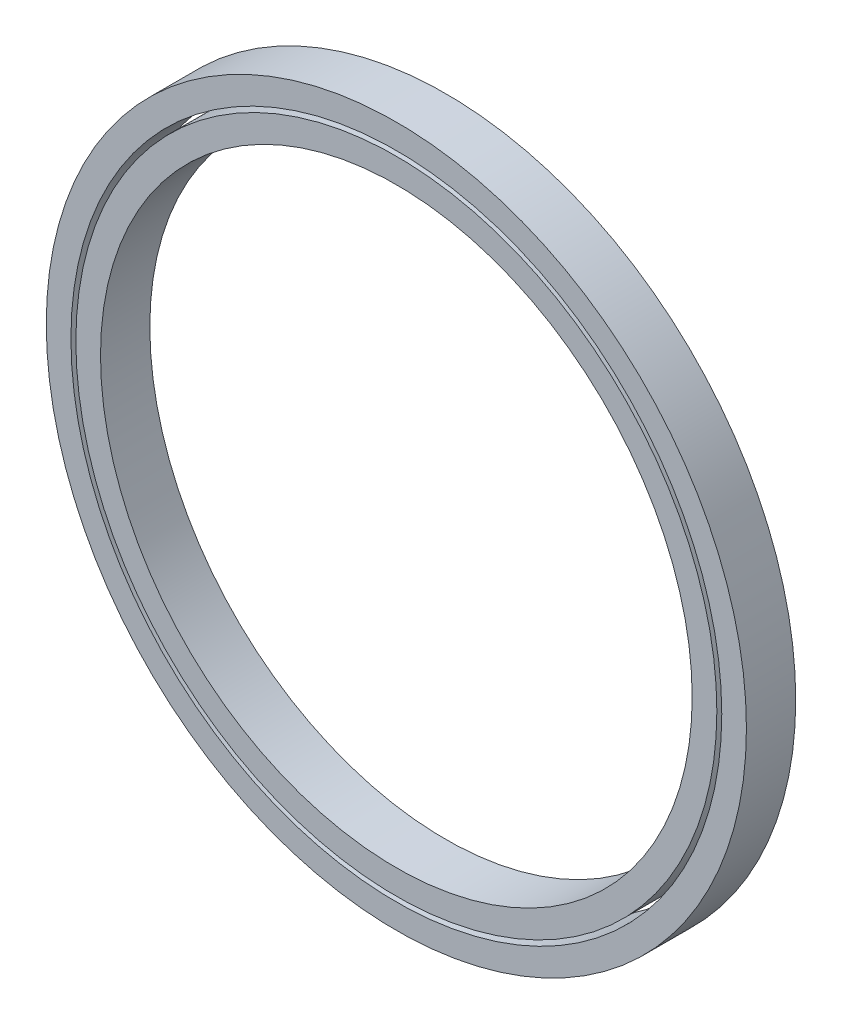
ISO-10303-21;
HEADER;
FILE_DESCRIPTION(('STEP AP214'),'2;1');
FILE_NAME('part.step','',(''),(''),'','','');
FILE_SCHEMA(('AUTOMOTIVE_DESIGN { 1 0 10303 214 1 1 1 1 }'));
ENDSEC;
DATA;
#1=APPLICATION_CONTEXT('core data for automotive mechanical design processes');
#2=APPLICATION_PROTOCOL_DEFINITION('international standard','automotive_design',2000,#1);
#3=PRODUCT_CONTEXT('',#1,'mechanical');
#4=PRODUCT('Part','Part','',(#3));
#5=PRODUCT_RELATED_PRODUCT_CATEGORY('part','',(#4));
#6=PRODUCT_DEFINITION_FORMATION('','',#4);
#7=PRODUCT_DEFINITION_CONTEXT('part definition',#1,'design');
#8=PRODUCT_DEFINITION('design','',#6,#7);
#9=PRODUCT_DEFINITION_SHAPE('','',#8);
#10=(LENGTH_UNIT() NAMED_UNIT(*) SI_UNIT(.MILLI.,.METRE.));
#11=(NAMED_UNIT(*) PLANE_ANGLE_UNIT() SI_UNIT($,.RADIAN.));
#12=(NAMED_UNIT(*) SI_UNIT($,.STERADIAN.) SOLID_ANGLE_UNIT());
#13=UNCERTAINTY_MEASURE_WITH_UNIT(LENGTH_MEASURE(1.E-05),#10,'distance_accuracy_value','');
#14=(GEOMETRIC_REPRESENTATION_CONTEXT(3) GLOBAL_UNCERTAINTY_ASSIGNED_CONTEXT((#13)) GLOBAL_UNIT_ASSIGNED_CONTEXT((#10,
#11,#12)) REPRESENTATION_CONTEXT('',''));
#15=CARTESIAN_POINT('',(0.,0.,0.));
#16=DIRECTION('',(0.,0.,1.));
#17=DIRECTION('',(1.,0.,0.));
#18=AXIS2_PLACEMENT_3D('',#15,#16,#17);
#19=CARTESIAN_POINT('',(0.,0.,2.5));
#20=DIRECTION('',(0.,0.,-1.));
#21=DIRECTION('',(-1.,0.,0.));
#22=AXIS2_PLACEMENT_3D('',#19,#20,#21);
#23=CYLINDRICAL_SURFACE('',#22,33.);
#24=CARTESIAN_POINT('',(0.,0.,2.5));
#25=DIRECTION('',(0.,0.,1.));
#26=DIRECTION('',(1.,0.,0.));
#27=AXIS2_PLACEMENT_3D('',#24,#25,#26);
#28=CIRCLE('',#27,33.);
#29=CARTESIAN_POINT('',(33.,0.,2.5));
#30=VERTEX_POINT('',#29);
#31=EDGE_CURVE('E62',#30,#30,#28,.T.);
#32=ORIENTED_EDGE('',*,*,#31,.T.);
#33=EDGE_LOOP('',(#32));
#34=FACE_BOUND('',#33,.T.);
#35=CARTESIAN_POINT('',(0.,0.,-2.5));
#36=DIRECTION('',(0.,0.,1.));
#37=DIRECTION('',(1.,0.,0.));
#38=AXIS2_PLACEMENT_3D('',#35,#36,#37);
#39=CIRCLE('',#38,33.);
#40=CARTESIAN_POINT('',(33.,0.,-2.5));
#41=VERTEX_POINT('',#40);
#42=EDGE_CURVE('E68',#41,#41,#39,.T.);
#43=ORIENTED_EDGE('',*,*,#42,.F.);
#44=EDGE_LOOP('',(#43));
#45=FACE_BOUND('',#44,.T.);
#46=ADVANCED_FACE('F55',(#34,#45),#23,.F.);
#47=CARTESIAN_POINT('',(0.,0.,2.5));
#48=DIRECTION('',(0.,0.,-1.));
#49=DIRECTION('',(-1.,0.,0.));
#50=AXIS2_PLACEMENT_3D('',#47,#48,#49);
#51=CYLINDRICAL_SURFACE('',#50,35.5);
#52=CARTESIAN_POINT('',(0.,0.,2.5));
#53=DIRECTION('',(0.,0.,1.));
#54=DIRECTION('',(1.,0.,0.));
#55=AXIS2_PLACEMENT_3D('',#52,#53,#54);
#56=CIRCLE('',#55,35.5);
#57=CARTESIAN_POINT('',(35.5,0.,2.5));
#58=VERTEX_POINT('',#57);
#59=EDGE_CURVE('E12',#58,#58,#56,.T.);
#60=ORIENTED_EDGE('',*,*,#59,.F.);
#61=EDGE_LOOP('',(#60));
#62=FACE_BOUND('',#61,.T.);
#63=CARTESIAN_POINT('',(0.,0.,-2.5));
#64=DIRECTION('',(0.,0.,1.));
#65=DIRECTION('',(1.,0.,0.));
#66=AXIS2_PLACEMENT_3D('',#63,#64,#65);
#67=CIRCLE('',#66,35.5);
#68=CARTESIAN_POINT('',(35.5,0.,-2.5));
#69=VERTEX_POINT('',#68);
#70=EDGE_CURVE('E58',#69,#69,#67,.T.);
#71=ORIENTED_EDGE('',*,*,#70,.T.);
#72=EDGE_LOOP('',(#71));
#73=FACE_BOUND('',#72,.T.);
#74=ADVANCED_FACE('F75',(#62,#73),#51,.T.);
#75=CARTESIAN_POINT('',(0.,0.,2.5));
#76=DIRECTION('',(0.,0.,1.));
#77=DIRECTION('',(1.,0.,0.));
#78=AXIS2_PLACEMENT_3D('',#75,#76,#77);
#79=PLANE('',#78);
#80=ORIENTED_EDGE('',*,*,#31,.F.);
#81=EDGE_LOOP('',(#80));
#82=FACE_BOUND('',#81,.T.);
#83=ORIENTED_EDGE('',*,*,#59,.T.);
#84=EDGE_LOOP('',(#83));
#85=FACE_BOUND('',#84,.T.);
#86=ADVANCED_FACE('F79',(#82,#85),#79,.T.);
#87=CARTESIAN_POINT('',(0.,0.,-2.5));
#88=DIRECTION('',(0.,0.,1.));
#89=DIRECTION('',(1.,0.,0.));
#90=AXIS2_PLACEMENT_3D('',#87,#88,#89);
#91=PLANE('',#90);
#92=ORIENTED_EDGE('',*,*,#42,.T.);
#93=EDGE_LOOP('',(#92));
#94=FACE_BOUND('',#93,.T.);
#95=ORIENTED_EDGE('',*,*,#70,.F.);
#96=EDGE_LOOP('',(#95));
#97=FACE_BOUND('',#96,.T.);
#98=ADVANCED_FACE('F77',(#94,#97),#91,.F.);
#99=CLOSED_SHELL('',(#46,#74,#86,#98));
#100=MANIFOLD_SOLID_BREP('B2',#99);
#101=CARTESIAN_POINT('',(0.,0.,2.5));
#102=DIRECTION('',(0.,0.,-1.));
#103=DIRECTION('',(-1.,0.,0.));
#104=AXIS2_PLACEMENT_3D('',#101,#102,#103);
#105=CYLINDRICAL_SURFACE('',#104,30.);
#106=CARTESIAN_POINT('',(0.,0.,2.5));
#107=DIRECTION('',(0.,0.,1.));
#108=DIRECTION('',(1.,0.,0.));
#109=AXIS2_PLACEMENT_3D('',#106,#107,#108);
#110=CIRCLE('',#109,30.);
#111=CARTESIAN_POINT('',(30.,0.,2.5));
#112=VERTEX_POINT('',#111);
#113=EDGE_CURVE('E124',#112,#112,#110,.T.);
#114=ORIENTED_EDGE('',*,*,#113,.T.);
#115=EDGE_LOOP('',(#114));
#116=FACE_BOUND('',#115,.T.);
#117=CARTESIAN_POINT('',(0.,0.,-2.5));
#118=DIRECTION('',(0.,0.,1.));
#119=DIRECTION('',(1.,0.,0.));
#120=AXIS2_PLACEMENT_3D('',#117,#118,#119);
#121=CIRCLE('',#120,30.);
#122=CARTESIAN_POINT('',(30.,0.,-2.5));
#123=VERTEX_POINT('',#122);
#124=EDGE_CURVE('E130',#123,#123,#121,.T.);
#125=ORIENTED_EDGE('',*,*,#124,.F.);
#126=EDGE_LOOP('',(#125));
#127=FACE_BOUND('',#126,.T.);
#128=ADVANCED_FACE('F117',(#116,#127),#105,.F.);
#129=CARTESIAN_POINT('',(0.,0.,2.5));
#130=DIRECTION('',(0.,0.,-1.));
#131=DIRECTION('',(-1.,0.,0.));
#132=AXIS2_PLACEMENT_3D('',#129,#130,#131);
#133=CYLINDRICAL_SURFACE('',#132,32.5);
#134=CARTESIAN_POINT('',(0.,0.,2.5));
#135=DIRECTION('',(0.,0.,1.));
#136=DIRECTION('',(1.,0.,0.));
#137=AXIS2_PLACEMENT_3D('',#134,#135,#136);
#138=CIRCLE('',#137,32.5);
#139=CARTESIAN_POINT('',(32.5,0.,2.5));
#140=VERTEX_POINT('',#139);
#141=EDGE_CURVE('E54',#140,#140,#138,.T.);
#142=ORIENTED_EDGE('',*,*,#141,.F.);
#143=EDGE_LOOP('',(#142));
#144=FACE_BOUND('',#143,.T.);
#145=CARTESIAN_POINT('',(0.,0.,-2.5));
#146=DIRECTION('',(0.,0.,1.));
#147=DIRECTION('',(1.,0.,0.));
#148=AXIS2_PLACEMENT_3D('',#145,#146,#147);
#149=CIRCLE('',#148,32.5);
#150=CARTESIAN_POINT('',(32.5,0.,-2.5));
#151=VERTEX_POINT('',#150);
#152=EDGE_CURVE('E120',#151,#151,#149,.T.);
#153=ORIENTED_EDGE('',*,*,#152,.T.);
#154=EDGE_LOOP('',(#153));
#155=FACE_BOUND('',#154,.T.);
#156=ADVANCED_FACE('F137',(#144,#155),#133,.T.);
#157=CARTESIAN_POINT('',(0.,0.,2.5));
#158=DIRECTION('',(0.,0.,1.));
#159=DIRECTION('',(1.,0.,0.));
#160=AXIS2_PLACEMENT_3D('',#157,#158,#159);
#161=PLANE('',#160);
#162=ORIENTED_EDGE('',*,*,#113,.F.);
#163=EDGE_LOOP('',(#162));
#164=FACE_BOUND('',#163,.T.);
#165=ORIENTED_EDGE('',*,*,#141,.T.);
#166=EDGE_LOOP('',(#165));
#167=FACE_BOUND('',#166,.T.);
#168=ADVANCED_FACE('F141',(#164,#167),#161,.T.);
#169=CARTESIAN_POINT('',(0.,0.,-2.5));
#170=DIRECTION('',(0.,0.,1.));
#171=DIRECTION('',(1.,0.,0.));
#172=AXIS2_PLACEMENT_3D('',#169,#170,#171);
#173=PLANE('',#172);
#174=ORIENTED_EDGE('',*,*,#124,.T.);
#175=EDGE_LOOP('',(#174));
#176=FACE_BOUND('',#175,.T.);
#177=ORIENTED_EDGE('',*,*,#152,.F.);
#178=EDGE_LOOP('',(#177));
#179=FACE_BOUND('',#178,.T.);
#180=ADVANCED_FACE('F139',(#176,#179),#173,.F.);
#181=CLOSED_SHELL('',(#128,#156,#168,#180));
#182=MANIFOLD_SOLID_BREP('B7',#181);
#183=ADVANCED_BREP_SHAPE_REPRESENTATION('',(#18,#100,#182),#14);
#184=SHAPE_DEFINITION_REPRESENTATION(#9,#183);
ENDSEC;
END-ISO-10303-21;
